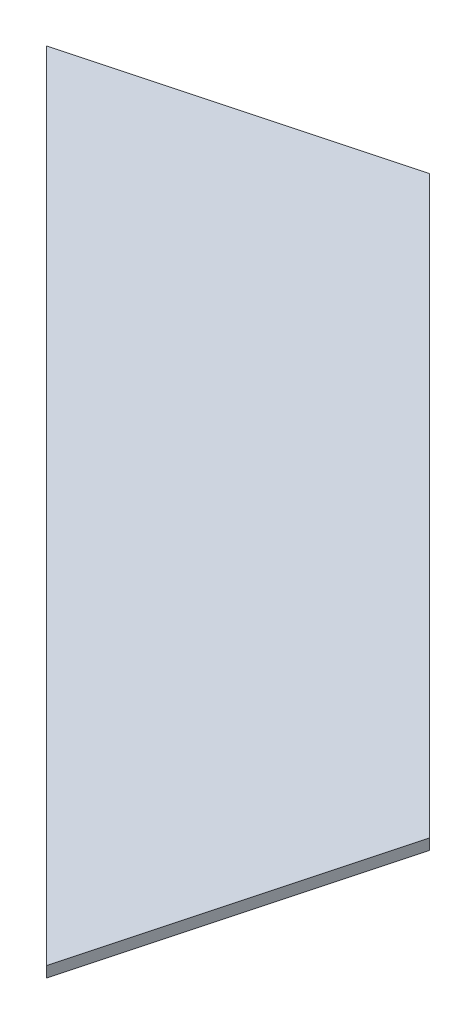
ISO-10303-21;
HEADER;
FILE_DESCRIPTION(('STEP AP214'),'2;1');
FILE_NAME('part.step','',(''),(''),'','','');
FILE_SCHEMA(('AUTOMOTIVE_DESIGN { 1 0 10303 214 1 1 1 1 }'));
ENDSEC;
DATA;
#1=APPLICATION_CONTEXT('core data for automotive mechanical design processes');
#2=APPLICATION_PROTOCOL_DEFINITION('international standard','automotive_design',2000,#1);
#3=PRODUCT_CONTEXT('',#1,'mechanical');
#4=PRODUCT('Part','Part','',(#3));
#5=PRODUCT_RELATED_PRODUCT_CATEGORY('part','',(#4));
#6=PRODUCT_DEFINITION_FORMATION('','',#4);
#7=PRODUCT_DEFINITION_CONTEXT('part definition',#1,'design');
#8=PRODUCT_DEFINITION('design','',#6,#7);
#9=PRODUCT_DEFINITION_SHAPE('','',#8);
#10=(LENGTH_UNIT() NAMED_UNIT(*) SI_UNIT(.MILLI.,.METRE.));
#11=(NAMED_UNIT(*) PLANE_ANGLE_UNIT() SI_UNIT($,.RADIAN.));
#12=(NAMED_UNIT(*) SI_UNIT($,.STERADIAN.) SOLID_ANGLE_UNIT());
#13=UNCERTAINTY_MEASURE_WITH_UNIT(LENGTH_MEASURE(1.E-05),#10,'distance_accuracy_value','');
#14=(GEOMETRIC_REPRESENTATION_CONTEXT(3) GLOBAL_UNCERTAINTY_ASSIGNED_CONTEXT((#13)) GLOBAL_UNIT_ASSIGNED_CONTEXT((#10,
#11,#12)) REPRESENTATION_CONTEXT('',''));
#15=CARTESIAN_POINT('',(0.,0.,0.));
#16=DIRECTION('',(0.,0.,1.));
#17=DIRECTION('',(1.,0.,0.));
#18=AXIS2_PLACEMENT_3D('',#15,#16,#17);
#19=CARTESIAN_POINT('',(-40.6364280773444,10.,-47.7074958892098));
#20=DIRECTION('',(0.707106781186547,0.,-0.707106781186548));
#21=DIRECTION('',(-0.707106781186548,0.,-0.707106781186547));
#22=AXIS2_PLACEMENT_3D('',#19,#20,#21);
#23=PLANE('',#22);
#24=DIRECTION('',(0.,1.,0.));
#25=VECTOR('',#24,1.);
#26=CARTESIAN_POINT('',(-30.,10.,-37.0710678118655));
#27=LINE('',#26,#25);
#28=CARTESIAN_POINT('',(-30.,10.,-37.0710678118655));
#29=VERTEX_POINT('',#28);
#30=CARTESIAN_POINT('',(-30.,10.2,-37.0710678118655));
#31=VERTEX_POINT('',#30);
#32=EDGE_CURVE('E11',#29,#31,#27,.T.);
#33=ORIENTED_EDGE('',*,*,#32,.F.);
#34=DIRECTION('',(-0.707106781186548,0.,-0.707106781186547));
#35=VECTOR('',#34,1.);
#36=CARTESIAN_POINT('',(-40.6364280773444,10.,-47.7074958892098));
#37=LINE('',#36,#35);
#38=CARTESIAN_POINT('',(-40.6364280773444,10.,-47.7074958892098));
#39=VERTEX_POINT('',#38);
#40=EDGE_CURVE('E88',#29,#39,#37,.T.);
#41=ORIENTED_EDGE('',*,*,#40,.T.);
#42=DIRECTION('',(0.,1.,0.));
#43=VECTOR('',#42,1.);
#44=CARTESIAN_POINT('',(-40.6364280773444,10.,-47.7074958892098));
#45=LINE('',#44,#43);
#46=CARTESIAN_POINT('',(-40.6364280773444,10.2,-47.7074958892098));
#47=VERTEX_POINT('',#46);
#48=EDGE_CURVE('E43',#39,#47,#45,.T.);
#49=ORIENTED_EDGE('',*,*,#48,.T.);
#50=DIRECTION('',(-0.707106781186548,0.,-0.707106781186547));
#51=VECTOR('',#50,1.);
#52=CARTESIAN_POINT('',(-40.6364280773444,10.2,-47.7074958892098));
#53=LINE('',#52,#51);
#54=EDGE_CURVE('E101',#31,#47,#53,.T.);
#55=ORIENTED_EDGE('',*,*,#54,.F.);
#56=EDGE_LOOP('',(#33,#41,#49,#55));
#57=FACE_BOUND('',#56,.T.);
#58=ADVANCED_FACE('F33',(#57),#23,.T.);
#59=CARTESIAN_POINT('',(-46.2132034355964,10.,-46.2132034355964));
#60=DIRECTION('',(-0.258819045102516,0.,-0.96592582628907));
#61=DIRECTION('',(-0.96592582628907,0.,0.258819045102516));
#62=AXIS2_PLACEMENT_3D('',#59,#60,#61);
#63=PLANE('',#62);
#64=ORIENTED_EDGE('',*,*,#48,.F.);
#65=DIRECTION('',(-0.96592582628907,0.,0.258819045102516));
#66=VECTOR('',#65,1.);
#67=CARTESIAN_POINT('',(-46.2132034355964,10.,-46.2132034355964));
#68=LINE('',#67,#66);
#69=CARTESIAN_POINT('',(-46.2132034355964,10.,-46.2132034355964));
#70=VERTEX_POINT('',#69);
#71=EDGE_CURVE('E95',#39,#70,#68,.T.);
#72=ORIENTED_EDGE('',*,*,#71,.T.);
#73=DIRECTION('',(0.,1.,0.));
#74=VECTOR('',#73,1.);
#75=CARTESIAN_POINT('',(-46.2132034355964,10.,-46.2132034355964));
#76=LINE('',#75,#74);
#77=CARTESIAN_POINT('',(-46.2132034355964,10.2,-46.2132034355964));
#78=VERTEX_POINT('',#77);
#79=EDGE_CURVE('E51',#70,#78,#76,.T.);
#80=ORIENTED_EDGE('',*,*,#79,.T.);
#81=DIRECTION('',(-0.96592582628907,0.,0.258819045102516));
#82=VECTOR('',#81,1.);
#83=CARTESIAN_POINT('',(-46.2132034355964,10.2,-46.2132034355964));
#84=LINE('',#83,#82);
#85=EDGE_CURVE('E82',#47,#78,#84,.T.);
#86=ORIENTED_EDGE('',*,*,#85,.F.);
#87=EDGE_LOOP('',(#64,#72,#80,#86));
#88=FACE_BOUND('',#87,.T.);
#89=ADVANCED_FACE('F105',(#88),#63,.T.);
#90=CARTESIAN_POINT('',(0.,10.,0.));
#91=DIRECTION('',(0.707106781186548,0.,-0.707106781186548));
#92=DIRECTION('',(-0.707106781186548,0.,-0.707106781186548));
#93=AXIS2_PLACEMENT_3D('',#90,#91,#92);
#94=PLANE('',#93);
#95=ORIENTED_EDGE('',*,*,#79,.F.);
#96=DIRECTION('',(-0.707106781186548,0.,-0.707106781186548));
#97=VECTOR('',#96,1.);
#98=CARTESIAN_POINT('',(0.,10.,0.));
#99=LINE('',#98,#97);
#100=CARTESIAN_POINT('',(-31.4942924536134,10.,-31.4942924536134));
#101=VERTEX_POINT('',#100);
#102=EDGE_CURVE('E87',#101,#70,#99,.T.);
#103=ORIENTED_EDGE('',*,*,#102,.F.);
#104=DIRECTION('',(0.,1.,0.));
#105=VECTOR('',#104,1.);
#106=CARTESIAN_POINT('',(-31.4942924536134,10.,-31.4942924536134));
#107=LINE('',#106,#105);
#108=CARTESIAN_POINT('',(-31.4942924536134,10.2,-31.4942924536134));
#109=VERTEX_POINT('',#108);
#110=EDGE_CURVE('E37',#101,#109,#107,.T.);
#111=ORIENTED_EDGE('',*,*,#110,.T.);
#112=DIRECTION('',(-0.707106781186548,0.,-0.707106781186548));
#113=VECTOR('',#112,1.);
#114=CARTESIAN_POINT('',(0.,10.2,0.));
#115=LINE('',#114,#113);
#116=EDGE_CURVE('E97',#109,#78,#115,.T.);
#117=ORIENTED_EDGE('',*,*,#116,.T.);
#118=EDGE_LOOP('',(#95,#103,#111,#117));
#119=FACE_BOUND('',#118,.T.);
#120=ADVANCED_FACE('F90',(#119),#94,.F.);
#121=CARTESIAN_POINT('',(-30.,10.,-37.0710678118655));
#122=DIRECTION('',(0.96592582628907,0.,0.258819045102516));
#123=DIRECTION('',(0.258819045102516,0.,-0.96592582628907));
#124=AXIS2_PLACEMENT_3D('',#121,#122,#123);
#125=PLANE('',#124);
#126=DIRECTION('',(0.258819045102516,0.,-0.96592582628907));
#127=VECTOR('',#126,1.);
#128=CARTESIAN_POINT('',(-30.,10.,-37.0710678118655));
#129=LINE('',#128,#127);
#130=EDGE_CURVE('E76',#101,#29,#129,.T.);
#131=ORIENTED_EDGE('',*,*,#130,.T.);
#132=ORIENTED_EDGE('',*,*,#32,.T.);
#133=DIRECTION('',(0.258819045102516,0.,-0.96592582628907));
#134=VECTOR('',#133,1.);
#135=CARTESIAN_POINT('',(-30.,10.2,-37.0710678118655));
#136=LINE('',#135,#134);
#137=EDGE_CURVE('E78',#109,#31,#136,.T.);
#138=ORIENTED_EDGE('',*,*,#137,.F.);
#139=ORIENTED_EDGE('',*,*,#110,.F.);
#140=EDGE_LOOP('',(#131,#132,#138,#139));
#141=FACE_BOUND('',#140,.T.);
#142=ADVANCED_FACE('F35',(#141),#125,.T.);
#143=CARTESIAN_POINT('',(0.,10.2,0.));
#144=DIRECTION('',(0.,1.,0.));
#145=DIRECTION('',(0.,0.,1.));
#146=AXIS2_PLACEMENT_3D('',#143,#144,#145);
#147=PLANE('',#146);
#148=ORIENTED_EDGE('',*,*,#116,.F.);
#149=ORIENTED_EDGE('',*,*,#137,.T.);
#150=ORIENTED_EDGE('',*,*,#54,.T.);
#151=ORIENTED_EDGE('',*,*,#85,.T.);
#152=EDGE_LOOP('',(#148,#149,#150,#151));
#153=FACE_BOUND('',#152,.T.);
#154=ADVANCED_FACE('F104',(#153),#147,.T.);
#155=CARTESIAN_POINT('',(0.,10.,0.));
#156=DIRECTION('',(0.,1.,0.));
#157=DIRECTION('',(0.,0.,1.));
#158=AXIS2_PLACEMENT_3D('',#155,#156,#157);
#159=PLANE('',#158);
#160=ORIENTED_EDGE('',*,*,#102,.T.);
#161=ORIENTED_EDGE('',*,*,#71,.F.);
#162=ORIENTED_EDGE('',*,*,#40,.F.);
#163=ORIENTED_EDGE('',*,*,#130,.F.);
#164=EDGE_LOOP('',(#160,#161,#162,#163));
#165=FACE_BOUND('',#164,.T.);
#166=ADVANCED_FACE('F85',(#165),#159,.F.);
#167=CLOSED_SHELL('',(#58,#89,#120,#142,#154,#166));
#168=MANIFOLD_SOLID_BREP('B2',#167);
#169=ADVANCED_BREP_SHAPE_REPRESENTATION('',(#18,#168),#14);
#170=SHAPE_DEFINITION_REPRESENTATION(#9,#169);
ENDSEC;
END-ISO-10303-21;
